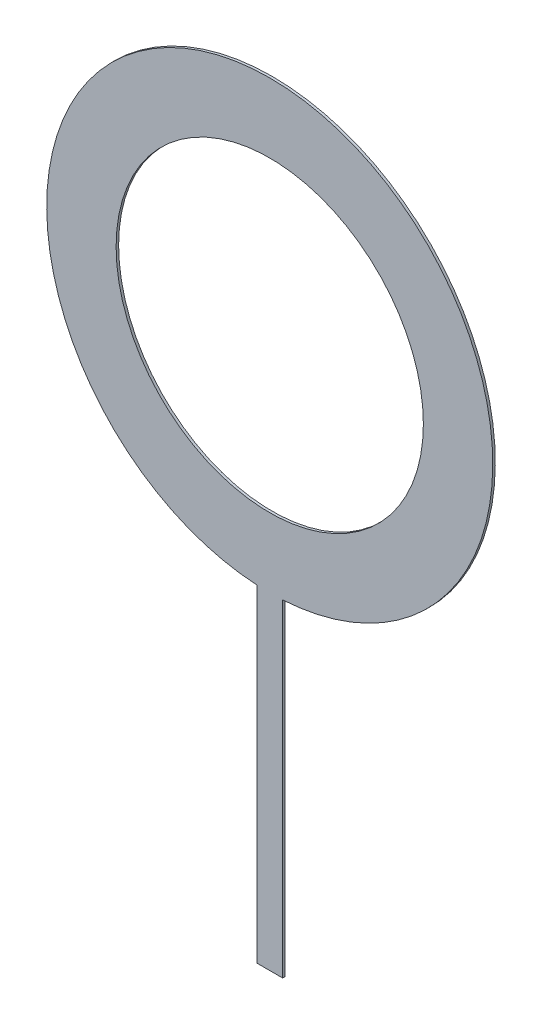
ISO-10303-21;
HEADER;
FILE_DESCRIPTION(('STEP AP214'),'2;1');
FILE_NAME('part.step','',(''),(''),'','','');
FILE_SCHEMA(('AUTOMOTIVE_DESIGN { 1 0 10303 214 1 1 1 1 }'));
ENDSEC;
DATA;
#1=APPLICATION_CONTEXT('core data for automotive mechanical design processes');
#2=APPLICATION_PROTOCOL_DEFINITION('international standard','automotive_design',2000,#1);
#3=PRODUCT_CONTEXT('',#1,'mechanical');
#4=PRODUCT('Part','Part','',(#3));
#5=PRODUCT_RELATED_PRODUCT_CATEGORY('part','',(#4));
#6=PRODUCT_DEFINITION_FORMATION('','',#4);
#7=PRODUCT_DEFINITION_CONTEXT('part definition',#1,'design');
#8=PRODUCT_DEFINITION('design','',#6,#7);
#9=PRODUCT_DEFINITION_SHAPE('','',#8);
#10=(LENGTH_UNIT() NAMED_UNIT(*) SI_UNIT(.MILLI.,.METRE.));
#11=(NAMED_UNIT(*) PLANE_ANGLE_UNIT() SI_UNIT($,.RADIAN.));
#12=(NAMED_UNIT(*) SI_UNIT($,.STERADIAN.) SOLID_ANGLE_UNIT());
#13=UNCERTAINTY_MEASURE_WITH_UNIT(LENGTH_MEASURE(1.E-05),#10,'distance_accuracy_value','');
#14=(GEOMETRIC_REPRESENTATION_CONTEXT(3) GLOBAL_UNCERTAINTY_ASSIGNED_CONTEXT((#13)) GLOBAL_UNIT_ASSIGNED_CONTEXT((#10,
#11,#12)) REPRESENTATION_CONTEXT('',''));
#15=CARTESIAN_POINT('',(0.,0.,0.));
#16=DIRECTION('',(0.,0.,1.));
#17=DIRECTION('',(1.,0.,0.));
#18=AXIS2_PLACEMENT_3D('',#15,#16,#17);
#19=CARTESIAN_POINT('',(0.,-27.75,0.127));
#20=DIRECTION('',(0.,1.,0.));
#21=DIRECTION('',(0.,0.,1.));
#22=AXIS2_PLACEMENT_3D('',#19,#20,#21);
#23=PLANE('',#22);
#24=DIRECTION('',(1.,0.,0.));
#25=VECTOR('',#24,1.);
#26=CARTESIAN_POINT('',(0.,-27.75,0.));
#27=LINE('',#26,#25);
#28=CARTESIAN_POINT('',(-0.65,-27.75,0.));
#29=VERTEX_POINT('',#28);
#30=CARTESIAN_POINT('',(0.65,-27.75,0.));
#31=VERTEX_POINT('',#30);
#32=EDGE_CURVE('E102',#29,#31,#27,.T.);
#33=ORIENTED_EDGE('',*,*,#32,.T.);
#34=DIRECTION('',(0.,0.,-1.));
#35=VECTOR('',#34,1.);
#36=CARTESIAN_POINT('',(0.65,-27.75,0.127));
#37=LINE('',#36,#35);
#38=CARTESIAN_POINT('',(0.65,-27.75,0.127));
#39=VERTEX_POINT('',#38);
#40=EDGE_CURVE('E11',#39,#31,#37,.T.);
#41=ORIENTED_EDGE('',*,*,#40,.F.);
#42=DIRECTION('',(1.,0.,0.));
#43=VECTOR('',#42,1.);
#44=CARTESIAN_POINT('',(0.,-27.75,0.127));
#45=LINE('',#44,#43);
#46=CARTESIAN_POINT('',(-0.65,-27.75,0.127));
#47=VERTEX_POINT('',#46);
#48=EDGE_CURVE('E85',#47,#39,#45,.T.);
#49=ORIENTED_EDGE('',*,*,#48,.F.);
#50=DIRECTION('',(0.,0.,-1.));
#51=VECTOR('',#50,1.);
#52=CARTESIAN_POINT('',(-0.65,-27.75,0.127));
#53=LINE('',#52,#51);
#54=EDGE_CURVE('E51',#47,#29,#53,.T.);
#55=ORIENTED_EDGE('',*,*,#54,.T.);
#56=EDGE_LOOP('',(#33,#41,#49,#55));
#57=FACE_BOUND('',#56,.T.);
#58=ADVANCED_FACE('F35',(#57),#23,.F.);
#59=CARTESIAN_POINT('',(0.650000000000001,0.,0.127));
#60=DIRECTION('',(-1.,0.,0.));
#61=DIRECTION('',(0.,-1.,0.));
#62=AXIS2_PLACEMENT_3D('',#59,#60,#61);
#63=PLANE('',#62);
#64=DIRECTION('',(0.,1.,0.));
#65=VECTOR('',#64,1.);
#66=CARTESIAN_POINT('',(0.650000000000001,0.,0.));
#67=LINE('',#66,#65);
#68=CARTESIAN_POINT('',(0.650000000000001,-11.2312065246794,0.));
#69=VERTEX_POINT('',#68);
#70=EDGE_CURVE('E90',#31,#69,#67,.T.);
#71=ORIENTED_EDGE('',*,*,#70,.T.);
#72=DIRECTION('',(0.,0.,-1.));
#73=VECTOR('',#72,1.);
#74=CARTESIAN_POINT('',(0.650000000000001,-11.2312065246794,0.127));
#75=LINE('',#74,#73);
#76=CARTESIAN_POINT('',(0.650000000000001,-11.2312065246794,0.127));
#77=VERTEX_POINT('',#76);
#78=EDGE_CURVE('E43',#77,#69,#75,.T.);
#79=ORIENTED_EDGE('',*,*,#78,.F.);
#80=DIRECTION('',(0.,1.,0.));
#81=VECTOR('',#80,1.);
#82=CARTESIAN_POINT('',(0.650000000000001,0.,0.127));
#83=LINE('',#82,#81);
#84=EDGE_CURVE('E77',#39,#77,#83,.T.);
#85=ORIENTED_EDGE('',*,*,#84,.F.);
#86=ORIENTED_EDGE('',*,*,#40,.T.);
#87=EDGE_LOOP('',(#71,#79,#85,#86));
#88=FACE_BOUND('',#87,.T.);
#89=ADVANCED_FACE('F89',(#88),#63,.F.);
#90=CARTESIAN_POINT('',(0.,0.,0.127));
#91=DIRECTION('',(0.,0.,-1.));
#92=DIRECTION('',(-1.,0.,0.));
#93=AXIS2_PLACEMENT_3D('',#90,#91,#92);
#94=CYLINDRICAL_SURFACE('',#93,11.25);
#95=CARTESIAN_POINT('',(0.,0.,0.));
#96=DIRECTION('',(0.,0.,1.));
#97=DIRECTION('',(1.,0.,0.));
#98=AXIS2_PLACEMENT_3D('',#95,#96,#97);
#99=CIRCLE('',#98,11.25);
#100=CARTESIAN_POINT('',(-0.65,-11.2312065246794,0.));
#101=VERTEX_POINT('',#100);
#102=EDGE_CURVE('E105',#69,#101,#99,.T.);
#103=ORIENTED_EDGE('',*,*,#102,.T.);
#104=DIRECTION('',(0.,0.,-1.));
#105=VECTOR('',#104,1.);
#106=CARTESIAN_POINT('',(-0.65,-11.2312065246794,0.127));
#107=LINE('',#106,#105);
#108=CARTESIAN_POINT('',(-0.65,-11.2312065246794,0.127));
#109=VERTEX_POINT('',#108);
#110=EDGE_CURVE('E66',#109,#101,#107,.T.);
#111=ORIENTED_EDGE('',*,*,#110,.F.);
#112=CARTESIAN_POINT('',(0.,0.,0.127));
#113=DIRECTION('',(0.,0.,1.));
#114=DIRECTION('',(1.,0.,0.));
#115=AXIS2_PLACEMENT_3D('',#112,#113,#114);
#116=CIRCLE('',#115,11.25);
#117=EDGE_CURVE('E84',#77,#109,#116,.T.);
#118=ORIENTED_EDGE('',*,*,#117,.F.);
#119=ORIENTED_EDGE('',*,*,#78,.T.);
#120=EDGE_LOOP('',(#103,#111,#118,#119));
#121=FACE_BOUND('',#120,.T.);
#122=ADVANCED_FACE('F93',(#121),#94,.T.);
#123=CARTESIAN_POINT('',(-0.65,0.,0.127));
#124=DIRECTION('',(-1.,0.,0.));
#125=DIRECTION('',(0.,-1.,0.));
#126=AXIS2_PLACEMENT_3D('',#123,#124,#125);
#127=PLANE('',#126);
#128=DIRECTION('',(0.,1.,0.));
#129=VECTOR('',#128,1.);
#130=CARTESIAN_POINT('',(-0.65,0.,0.));
#131=LINE('',#130,#129);
#132=EDGE_CURVE('E107',#29,#101,#131,.T.);
#133=ORIENTED_EDGE('',*,*,#132,.F.);
#134=ORIENTED_EDGE('',*,*,#54,.F.);
#135=DIRECTION('',(0.,1.,0.));
#136=VECTOR('',#135,1.);
#137=CARTESIAN_POINT('',(-0.65,0.,0.127));
#138=LINE('',#137,#136);
#139=EDGE_CURVE('E94',#47,#109,#138,.T.);
#140=ORIENTED_EDGE('',*,*,#139,.T.);
#141=ORIENTED_EDGE('',*,*,#110,.T.);
#142=EDGE_LOOP('',(#133,#134,#140,#141));
#143=FACE_BOUND('',#142,.T.);
#144=ADVANCED_FACE('F120',(#143),#127,.T.);
#145=CARTESIAN_POINT('',(0.,0.,0.127));
#146=DIRECTION('',(0.,0.,-1.));
#147=DIRECTION('',(-1.,0.,0.));
#148=AXIS2_PLACEMENT_3D('',#145,#146,#147);
#149=CYLINDRICAL_SURFACE('',#148,7.75);
#150=CARTESIAN_POINT('',(0.,0.,0.127));
#151=DIRECTION('',(0.,0.,1.));
#152=DIRECTION('',(1.,0.,0.));
#153=AXIS2_PLACEMENT_3D('',#150,#151,#152);
#154=CIRCLE('',#153,7.75);
#155=CARTESIAN_POINT('',(7.75,0.,0.127));
#156=VERTEX_POINT('',#155);
#157=EDGE_CURVE('E96',#156,#156,#154,.T.);
#158=ORIENTED_EDGE('',*,*,#157,.T.);
#159=EDGE_LOOP('',(#158));
#160=FACE_BOUND('',#159,.T.);
#161=CARTESIAN_POINT('',(0.,0.,0.));
#162=DIRECTION('',(0.,0.,1.));
#163=DIRECTION('',(1.,0.,0.));
#164=AXIS2_PLACEMENT_3D('',#161,#162,#163);
#165=CIRCLE('',#164,7.75);
#166=CARTESIAN_POINT('',(7.75,0.,0.));
#167=VERTEX_POINT('',#166);
#168=EDGE_CURVE('E110',#167,#167,#165,.T.);
#169=ORIENTED_EDGE('',*,*,#168,.F.);
#170=EDGE_LOOP('',(#169));
#171=FACE_BOUND('',#170,.T.);
#172=ADVANCED_FACE('F118',(#160,#171),#149,.F.);
#173=CARTESIAN_POINT('',(0.,0.,0.127));
#174=DIRECTION('',(0.,0.,1.));
#175=DIRECTION('',(1.,0.,0.));
#176=AXIS2_PLACEMENT_3D('',#173,#174,#175);
#177=PLANE('',#176);
#178=ORIENTED_EDGE('',*,*,#48,.T.);
#179=ORIENTED_EDGE('',*,*,#84,.T.);
#180=ORIENTED_EDGE('',*,*,#117,.T.);
#181=ORIENTED_EDGE('',*,*,#139,.F.);
#182=EDGE_LOOP('',(#178,#179,#180,#181));
#183=FACE_BOUND('',#182,.T.);
#184=ORIENTED_EDGE('',*,*,#157,.F.);
#185=EDGE_LOOP('',(#184));
#186=FACE_BOUND('',#185,.T.);
#187=ADVANCED_FACE('F80',(#183,#186),#177,.T.);
#188=CARTESIAN_POINT('',(0.,0.,0.));
#189=DIRECTION('',(0.,0.,1.));
#190=DIRECTION('',(1.,0.,0.));
#191=AXIS2_PLACEMENT_3D('',#188,#189,#190);
#192=PLANE('',#191);
#193=ORIENTED_EDGE('',*,*,#32,.F.);
#194=ORIENTED_EDGE('',*,*,#132,.T.);
#195=ORIENTED_EDGE('',*,*,#102,.F.);
#196=ORIENTED_EDGE('',*,*,#70,.F.);
#197=EDGE_LOOP('',(#193,#194,#195,#196));
#198=FACE_BOUND('',#197,.T.);
#199=ORIENTED_EDGE('',*,*,#168,.T.);
#200=EDGE_LOOP('',(#199));
#201=FACE_BOUND('',#200,.T.);
#202=ADVANCED_FACE('F116',(#198,#201),#192,.F.);
#203=CLOSED_SHELL('',(#58,#89,#122,#144,#172,#187,#202));
#204=MANIFOLD_SOLID_BREP('B2',#203);
#205=ADVANCED_BREP_SHAPE_REPRESENTATION('',(#18,#204),#14);
#206=SHAPE_DEFINITION_REPRESENTATION(#9,#205);
ENDSEC;
END-ISO-10303-21;
